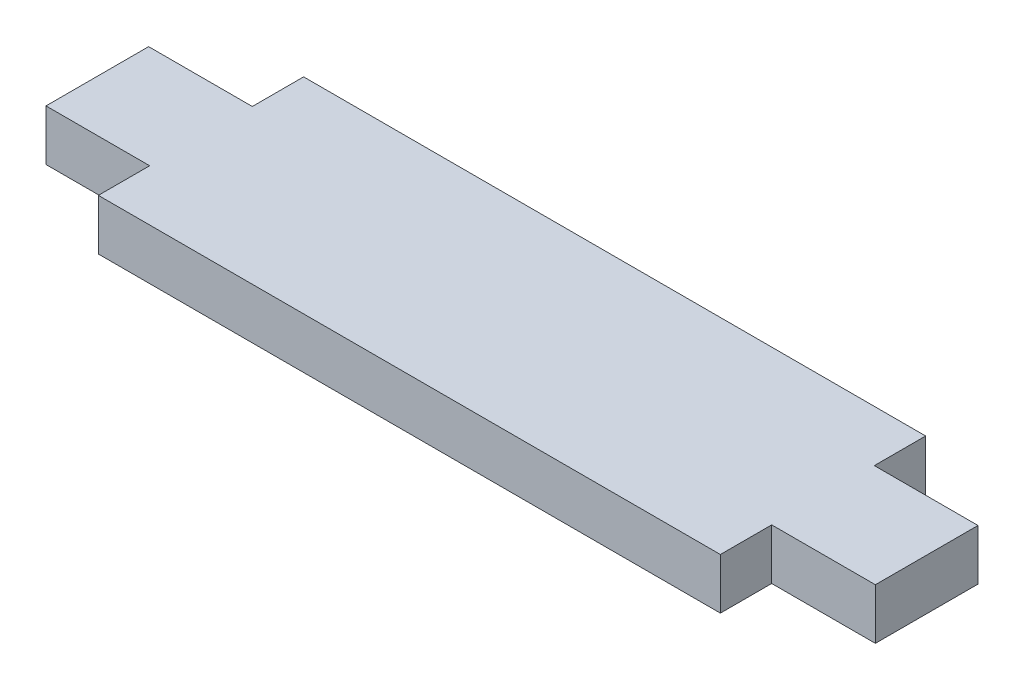
ISO-10303-21;
HEADER;
FILE_DESCRIPTION(('STEP AP214'),'2;1');
FILE_NAME('part.step','',(''),(''),'','','');
FILE_SCHEMA(('AUTOMOTIVE_DESIGN { 1 0 10303 214 1 1 1 1 }'));
ENDSEC;
DATA;
#1=APPLICATION_CONTEXT('core data for automotive mechanical design processes');
#2=APPLICATION_PROTOCOL_DEFINITION('international standard','automotive_design',2000,#1);
#3=PRODUCT_CONTEXT('',#1,'mechanical');
#4=PRODUCT('Part','Part','',(#3));
#5=PRODUCT_RELATED_PRODUCT_CATEGORY('part','',(#4));
#6=PRODUCT_DEFINITION_FORMATION('','',#4);
#7=PRODUCT_DEFINITION_CONTEXT('part definition',#1,'design');
#8=PRODUCT_DEFINITION('design','',#6,#7);
#9=PRODUCT_DEFINITION_SHAPE('','',#8);
#10=(LENGTH_UNIT() NAMED_UNIT(*) SI_UNIT(.MILLI.,.METRE.));
#11=(NAMED_UNIT(*) PLANE_ANGLE_UNIT() SI_UNIT($,.RADIAN.));
#12=(NAMED_UNIT(*) SI_UNIT($,.STERADIAN.) SOLID_ANGLE_UNIT());
#13=UNCERTAINTY_MEASURE_WITH_UNIT(LENGTH_MEASURE(1.E-05),#10,'distance_accuracy_value','');
#14=(GEOMETRIC_REPRESENTATION_CONTEXT(3) GLOBAL_UNCERTAINTY_ASSIGNED_CONTEXT((#13)) GLOBAL_UNIT_ASSIGNED_CONTEXT((#10,
#11,#12)) REPRESENTATION_CONTEXT('',''));
#15=CARTESIAN_POINT('',(0.,0.,0.));
#16=DIRECTION('',(0.,0.,1.));
#17=DIRECTION('',(1.,0.,0.));
#18=AXIS2_PLACEMENT_3D('',#15,#16,#17);
#19=CARTESIAN_POINT('',(-30.,0.,0.));
#20=DIRECTION('',(-1.,0.,0.));
#21=DIRECTION('',(0.,0.,1.));
#22=AXIS2_PLACEMENT_3D('',#19,#20,#21);
#23=PLANE('',#22);
#24=DIRECTION('',(0.,0.,-1.));
#25=VECTOR('',#24,1.);
#26=CARTESIAN_POINT('',(-30.,-2.45,9.9));
#27=LINE('',#26,#25);
#28=CARTESIAN_POINT('',(-30.,-2.45,-4.95));
#29=VERTEX_POINT('',#28);
#30=CARTESIAN_POINT('',(-30.,-2.45,-9.9));
#31=VERTEX_POINT('',#30);
#32=EDGE_CURVE('E238',#29,#31,#27,.T.);
#33=ORIENTED_EDGE('',*,*,#32,.F.);
#34=DIRECTION('',(0.,1.,0.));
#35=VECTOR('',#34,1.);
#36=CARTESIAN_POINT('',(-30.,-2.45,-4.95));
#37=LINE('',#36,#35);
#38=CARTESIAN_POINT('',(-30.,2.45,-4.95));
#39=VERTEX_POINT('',#38);
#40=EDGE_CURVE('E136',#29,#39,#37,.T.);
#41=ORIENTED_EDGE('',*,*,#40,.T.);
#42=DIRECTION('',(0.,0.,1.));
#43=VECTOR('',#42,1.);
#44=CARTESIAN_POINT('',(-30.,2.45,9.9));
#45=LINE('',#44,#43);
#46=CARTESIAN_POINT('',(-30.,2.45,-9.9));
#47=VERTEX_POINT('',#46);
#48=EDGE_CURVE('E231',#47,#39,#45,.T.);
#49=ORIENTED_EDGE('',*,*,#48,.F.);
#50=DIRECTION('',(0.,1.,0.));
#51=VECTOR('',#50,1.);
#52=CARTESIAN_POINT('',(-30.,-2.45,-9.9));
#53=LINE('',#52,#51);
#54=EDGE_CURVE('E209',#31,#47,#53,.T.);
#55=ORIENTED_EDGE('',*,*,#54,.F.);
#56=EDGE_LOOP('',(#33,#41,#49,#55));
#57=FACE_BOUND('',#56,.T.);
#58=ADVANCED_FACE('F39',(#57),#23,.T.);
#59=CARTESIAN_POINT('',(-30.,2.45,4.95));
#60=VERTEX_POINT('',#59);
#61=CARTESIAN_POINT('',(-30.,2.45,9.9));
#62=VERTEX_POINT('',#61);
#63=EDGE_CURVE('E230',#60,#62,#45,.T.);
#64=ORIENTED_EDGE('',*,*,#63,.F.);
#65=DIRECTION('',(0.,-1.,0.));
#66=VECTOR('',#65,1.);
#67=CARTESIAN_POINT('',(-30.,-2.45,4.95));
#68=LINE('',#67,#66);
#69=CARTESIAN_POINT('',(-30.,-2.45,4.95));
#70=VERTEX_POINT('',#69);
#71=EDGE_CURVE('E150',#60,#70,#68,.T.);
#72=ORIENTED_EDGE('',*,*,#71,.T.);
#73=CARTESIAN_POINT('',(-30.,-2.45,9.9));
#74=VERTEX_POINT('',#73);
#75=EDGE_CURVE('E215',#74,#70,#27,.T.);
#76=ORIENTED_EDGE('',*,*,#75,.F.);
#77=DIRECTION('',(0.,-1.,0.));
#78=VECTOR('',#77,1.);
#79=CARTESIAN_POINT('',(-30.,-2.45,9.9));
#80=LINE('',#79,#78);
#81=EDGE_CURVE('E235',#62,#74,#80,.T.);
#82=ORIENTED_EDGE('',*,*,#81,.F.);
#83=EDGE_LOOP('',(#64,#72,#76,#82));
#84=FACE_BOUND('',#83,.T.);
#85=ADVANCED_FACE('F260',(#84),#23,.T.);
#86=CARTESIAN_POINT('',(30.,0.,0.));
#87=DIRECTION('',(-1.,0.,0.));
#88=DIRECTION('',(0.,0.,1.));
#89=AXIS2_PLACEMENT_3D('',#86,#87,#88);
#90=PLANE('',#89);
#91=DIRECTION('',(0.,1.,0.));
#92=VECTOR('',#91,1.);
#93=CARTESIAN_POINT('',(30.,-2.45,-4.95));
#94=LINE('',#93,#92);
#95=CARTESIAN_POINT('',(30.,-2.45,-4.95));
#96=VERTEX_POINT('',#95);
#97=CARTESIAN_POINT('',(30.,2.45,-4.95));
#98=VERTEX_POINT('',#97);
#99=EDGE_CURVE('E63',#96,#98,#94,.T.);
#100=ORIENTED_EDGE('',*,*,#99,.F.);
#101=DIRECTION('',(0.,0.,-1.));
#102=VECTOR('',#101,1.);
#103=CARTESIAN_POINT('',(30.,-2.45,9.9));
#104=LINE('',#103,#102);
#105=CARTESIAN_POINT('',(30.,-2.45,-9.9));
#106=VERTEX_POINT('',#105);
#107=EDGE_CURVE('E222',#96,#106,#104,.T.);
#108=ORIENTED_EDGE('',*,*,#107,.T.);
#109=DIRECTION('',(0.,1.,0.));
#110=VECTOR('',#109,1.);
#111=CARTESIAN_POINT('',(30.,-2.45,-9.9));
#112=LINE('',#111,#110);
#113=CARTESIAN_POINT('',(30.,2.45,-9.9));
#114=VERTEX_POINT('',#113);
#115=EDGE_CURVE('E210',#106,#114,#112,.T.);
#116=ORIENTED_EDGE('',*,*,#115,.T.);
#117=DIRECTION('',(0.,0.,1.));
#118=VECTOR('',#117,1.);
#119=CARTESIAN_POINT('',(30.,2.45,9.9));
#120=LINE('',#119,#118);
#121=EDGE_CURVE('E216',#114,#98,#120,.T.);
#122=ORIENTED_EDGE('',*,*,#121,.T.);
#123=EDGE_LOOP('',(#100,#108,#116,#122));
#124=FACE_BOUND('',#123,.T.);
#125=ADVANCED_FACE('F290',(#124),#90,.F.);
#126=DIRECTION('',(0.,-1.,0.));
#127=VECTOR('',#126,1.);
#128=CARTESIAN_POINT('',(30.,-2.45,4.95));
#129=LINE('',#128,#127);
#130=CARTESIAN_POINT('',(30.,2.45,4.95));
#131=VERTEX_POINT('',#130);
#132=CARTESIAN_POINT('',(30.,-2.45,4.95));
#133=VERTEX_POINT('',#132);
#134=EDGE_CURVE('E179',#131,#133,#129,.T.);
#135=ORIENTED_EDGE('',*,*,#134,.F.);
#136=CARTESIAN_POINT('',(30.,2.45,9.9));
#137=VERTEX_POINT('',#136);
#138=EDGE_CURVE('E214',#131,#137,#120,.T.);
#139=ORIENTED_EDGE('',*,*,#138,.T.);
#140=DIRECTION('',(0.,-1.,0.));
#141=VECTOR('',#140,1.);
#142=CARTESIAN_POINT('',(30.,-2.45,9.9));
#143=LINE('',#142,#141);
#144=CARTESIAN_POINT('',(30.,-2.45,9.9));
#145=VERTEX_POINT('',#144);
#146=EDGE_CURVE('E219',#137,#145,#143,.T.);
#147=ORIENTED_EDGE('',*,*,#146,.T.);
#148=EDGE_CURVE('E223',#145,#133,#104,.T.);
#149=ORIENTED_EDGE('',*,*,#148,.T.);
#150=EDGE_LOOP('',(#135,#139,#147,#149));
#151=FACE_BOUND('',#150,.T.);
#152=ADVANCED_FACE('F265',(#151),#90,.F.);
#153=CARTESIAN_POINT('',(30.,-2.45,-9.9));
#154=DIRECTION('',(0.,0.,1.));
#155=DIRECTION('',(1.,0.,0.));
#156=AXIS2_PLACEMENT_3D('',#153,#154,#155);
#157=PLANE('',#156);
#158=ORIENTED_EDGE('',*,*,#54,.T.);
#159=DIRECTION('',(-1.,0.,0.));
#160=VECTOR('',#159,1.);
#161=CARTESIAN_POINT('',(30.,2.45,-9.9));
#162=LINE('',#161,#160);
#163=EDGE_CURVE('E11',#114,#47,#162,.T.);
#164=ORIENTED_EDGE('',*,*,#163,.F.);
#165=ORIENTED_EDGE('',*,*,#115,.F.);
#166=DIRECTION('',(-1.,0.,0.));
#167=VECTOR('',#166,1.);
#168=CARTESIAN_POINT('',(30.,-2.45,-9.9));
#169=LINE('',#168,#167);
#170=EDGE_CURVE('E226',#106,#31,#169,.T.);
#171=ORIENTED_EDGE('',*,*,#170,.T.);
#172=EDGE_LOOP('',(#158,#164,#165,#171));
#173=FACE_BOUND('',#172,.T.);
#174=ADVANCED_FACE('F41',(#173),#157,.F.);
#175=CARTESIAN_POINT('',(30.,2.45,9.9));
#176=DIRECTION('',(0.,-1.,0.));
#177=DIRECTION('',(0.,0.,-1.));
#178=AXIS2_PLACEMENT_3D('',#175,#176,#177);
#179=PLANE('',#178);
#180=ORIENTED_EDGE('',*,*,#48,.T.);
#181=DIRECTION('',(1.,0.,0.));
#182=VECTOR('',#181,1.);
#183=CARTESIAN_POINT('',(-40.,2.45,-4.95));
#184=LINE('',#183,#182);
#185=CARTESIAN_POINT('',(-40.,2.45,-4.95));
#186=VERTEX_POINT('',#185);
#187=EDGE_CURVE('E162',#186,#39,#184,.T.);
#188=ORIENTED_EDGE('',*,*,#187,.F.);
#189=DIRECTION('',(0.,0.,1.));
#190=VECTOR('',#189,1.);
#191=CARTESIAN_POINT('',(-40.,2.45,4.95));
#192=LINE('',#191,#190);
#193=CARTESIAN_POINT('',(-40.,2.45,4.95));
#194=VERTEX_POINT('',#193);
#195=EDGE_CURVE('E148',#186,#194,#192,.T.);
#196=ORIENTED_EDGE('',*,*,#195,.T.);
#197=DIRECTION('',(1.,0.,0.));
#198=VECTOR('',#197,1.);
#199=CARTESIAN_POINT('',(-40.,2.45,4.95));
#200=LINE('',#199,#198);
#201=EDGE_CURVE('E169',#194,#60,#200,.T.);
#202=ORIENTED_EDGE('',*,*,#201,.T.);
#203=ORIENTED_EDGE('',*,*,#63,.T.);
#204=DIRECTION('',(-1.,0.,0.));
#205=VECTOR('',#204,1.);
#206=CARTESIAN_POINT('',(30.,2.45,9.9));
#207=LINE('',#206,#205);
#208=EDGE_CURVE('E48',#137,#62,#207,.T.);
#209=ORIENTED_EDGE('',*,*,#208,.F.);
#210=ORIENTED_EDGE('',*,*,#138,.F.);
#211=DIRECTION('',(-1.,0.,0.));
#212=VECTOR('',#211,1.);
#213=CARTESIAN_POINT('',(40.,2.45,4.95));
#214=LINE('',#213,#212);
#215=CARTESIAN_POINT('',(40.,2.45,4.95));
#216=VERTEX_POINT('',#215);
#217=EDGE_CURVE('E201',#216,#131,#214,.T.);
#218=ORIENTED_EDGE('',*,*,#217,.F.);
#219=DIRECTION('',(0.,0.,1.));
#220=VECTOR('',#219,1.);
#221=CARTESIAN_POINT('',(40.,2.45,4.95));
#222=LINE('',#221,#220);
#223=CARTESIAN_POINT('',(40.,2.45,-4.95));
#224=VERTEX_POINT('',#223);
#225=EDGE_CURVE('E178',#224,#216,#222,.T.);
#226=ORIENTED_EDGE('',*,*,#225,.F.);
#227=DIRECTION('',(-1.,0.,0.));
#228=VECTOR('',#227,1.);
#229=CARTESIAN_POINT('',(40.,2.45,-4.95));
#230=LINE('',#229,#228);
#231=EDGE_CURVE('E205',#224,#98,#230,.T.);
#232=ORIENTED_EDGE('',*,*,#231,.T.);
#233=ORIENTED_EDGE('',*,*,#121,.F.);
#234=ORIENTED_EDGE('',*,*,#163,.T.);
#235=EDGE_LOOP('',(#180,#188,#196,#202,#203,#209,#210,#218,#226,#232,#233,#234));
#236=FACE_BOUND('',#235,.T.);
#237=ADVANCED_FACE('F270',(#236),#179,.F.);
#238=CARTESIAN_POINT('',(30.,-2.45,9.9));
#239=DIRECTION('',(0.,0.,-1.));
#240=DIRECTION('',(-1.,0.,0.));
#241=AXIS2_PLACEMENT_3D('',#238,#239,#240);
#242=PLANE('',#241);
#243=ORIENTED_EDGE('',*,*,#81,.T.);
#244=DIRECTION('',(-1.,0.,0.));
#245=VECTOR('',#244,1.);
#246=CARTESIAN_POINT('',(30.,-2.45,9.9));
#247=LINE('',#246,#245);
#248=EDGE_CURVE('E244',#145,#74,#247,.T.);
#249=ORIENTED_EDGE('',*,*,#248,.F.);
#250=ORIENTED_EDGE('',*,*,#146,.F.);
#251=ORIENTED_EDGE('',*,*,#208,.T.);
#252=EDGE_LOOP('',(#243,#249,#250,#251));
#253=FACE_BOUND('',#252,.T.);
#254=ADVANCED_FACE('F253',(#253),#242,.F.);
#255=CARTESIAN_POINT('',(30.,-2.45,9.9));
#256=DIRECTION('',(0.,1.,0.));
#257=DIRECTION('',(0.,0.,1.));
#258=AXIS2_PLACEMENT_3D('',#255,#256,#257);
#259=PLANE('',#258);
#260=ORIENTED_EDGE('',*,*,#75,.T.);
#261=DIRECTION('',(1.,0.,0.));
#262=VECTOR('',#261,1.);
#263=CARTESIAN_POINT('',(-40.,-2.45,4.95));
#264=LINE('',#263,#262);
#265=CARTESIAN_POINT('',(-40.,-2.45,4.95));
#266=VERTEX_POINT('',#265);
#267=EDGE_CURVE('E55',#266,#70,#264,.T.);
#268=ORIENTED_EDGE('',*,*,#267,.F.);
#269=DIRECTION('',(0.,0.,-1.));
#270=VECTOR('',#269,1.);
#271=CARTESIAN_POINT('',(-40.,-2.45,4.95));
#272=LINE('',#271,#270);
#273=CARTESIAN_POINT('',(-40.,-2.45,-4.95));
#274=VERTEX_POINT('',#273);
#275=EDGE_CURVE('E146',#266,#274,#272,.T.);
#276=ORIENTED_EDGE('',*,*,#275,.T.);
#277=DIRECTION('',(1.,0.,0.));
#278=VECTOR('',#277,1.);
#279=CARTESIAN_POINT('',(-40.,-2.45,-4.95));
#280=LINE('',#279,#278);
#281=EDGE_CURVE('E130',#274,#29,#280,.T.);
#282=ORIENTED_EDGE('',*,*,#281,.T.);
#283=ORIENTED_EDGE('',*,*,#32,.T.);
#284=ORIENTED_EDGE('',*,*,#170,.F.);
#285=ORIENTED_EDGE('',*,*,#107,.F.);
#286=DIRECTION('',(-1.,0.,0.));
#287=VECTOR('',#286,1.);
#288=CARTESIAN_POINT('',(40.,-2.45,-4.95));
#289=LINE('',#288,#287);
#290=CARTESIAN_POINT('',(40.,-2.45,-4.95));
#291=VERTEX_POINT('',#290);
#292=EDGE_CURVE('E188',#291,#96,#289,.T.);
#293=ORIENTED_EDGE('',*,*,#292,.F.);
#294=DIRECTION('',(0.,0.,-1.));
#295=VECTOR('',#294,1.);
#296=CARTESIAN_POINT('',(40.,-2.45,4.95));
#297=LINE('',#296,#295);
#298=CARTESIAN_POINT('',(40.,-2.45,4.95));
#299=VERTEX_POINT('',#298);
#300=EDGE_CURVE('E185',#299,#291,#297,.T.);
#301=ORIENTED_EDGE('',*,*,#300,.F.);
#302=DIRECTION('',(-1.,0.,0.));
#303=VECTOR('',#302,1.);
#304=CARTESIAN_POINT('',(40.,-2.45,4.95));
#305=LINE('',#304,#303);
#306=EDGE_CURVE('E197',#299,#133,#305,.T.);
#307=ORIENTED_EDGE('',*,*,#306,.T.);
#308=ORIENTED_EDGE('',*,*,#148,.F.);
#309=ORIENTED_EDGE('',*,*,#248,.T.);
#310=EDGE_LOOP('',(#260,#268,#276,#282,#283,#284,#285,#293,#301,#307,#308,#309));
#311=FACE_BOUND('',#310,.T.);
#312=ADVANCED_FACE('F153',(#311),#259,.F.);
#313=CARTESIAN_POINT('',(40.,-2.45,-4.95));
#314=DIRECTION('',(0.,0.,1.));
#315=DIRECTION('',(1.,0.,0.));
#316=AXIS2_PLACEMENT_3D('',#313,#314,#315);
#317=PLANE('',#316);
#318=ORIENTED_EDGE('',*,*,#99,.T.);
#319=ORIENTED_EDGE('',*,*,#231,.F.);
#320=DIRECTION('',(0.,1.,0.));
#321=VECTOR('',#320,1.);
#322=CARTESIAN_POINT('',(40.,-2.45,-4.95));
#323=LINE('',#322,#321);
#324=EDGE_CURVE('E174',#291,#224,#323,.T.);
#325=ORIENTED_EDGE('',*,*,#324,.F.);
#326=ORIENTED_EDGE('',*,*,#292,.T.);
#327=EDGE_LOOP('',(#318,#319,#325,#326));
#328=FACE_BOUND('',#327,.T.);
#329=ADVANCED_FACE('F296',(#328),#317,.F.);
#330=CARTESIAN_POINT('',(40.,-2.45,4.95));
#331=DIRECTION('',(0.,0.,-1.));
#332=DIRECTION('',(-1.,0.,0.));
#333=AXIS2_PLACEMENT_3D('',#330,#331,#332);
#334=PLANE('',#333);
#335=ORIENTED_EDGE('',*,*,#134,.T.);
#336=ORIENTED_EDGE('',*,*,#306,.F.);
#337=DIRECTION('',(0.,-1.,0.));
#338=VECTOR('',#337,1.);
#339=CARTESIAN_POINT('',(40.,-2.45,4.95));
#340=LINE('',#339,#338);
#341=EDGE_CURVE('E182',#216,#299,#340,.T.);
#342=ORIENTED_EDGE('',*,*,#341,.F.);
#343=ORIENTED_EDGE('',*,*,#217,.T.);
#344=EDGE_LOOP('',(#335,#336,#342,#343));
#345=FACE_BOUND('',#344,.T.);
#346=ADVANCED_FACE('F267',(#345),#334,.F.);
#347=CARTESIAN_POINT('',(40.,0.,0.));
#348=DIRECTION('',(-1.,0.,0.));
#349=DIRECTION('',(0.,0.,1.));
#350=AXIS2_PLACEMENT_3D('',#347,#348,#349);
#351=PLANE('',#350);
#352=ORIENTED_EDGE('',*,*,#324,.T.);
#353=ORIENTED_EDGE('',*,*,#225,.T.);
#354=ORIENTED_EDGE('',*,*,#341,.T.);
#355=ORIENTED_EDGE('',*,*,#300,.T.);
#356=EDGE_LOOP('',(#352,#353,#354,#355));
#357=FACE_BOUND('',#356,.T.);
#358=ADVANCED_FACE('F282',(#357),#351,.F.);
#359=CARTESIAN_POINT('',(-40.,-2.45,-4.95));
#360=DIRECTION('',(0.,0.,-1.));
#361=DIRECTION('',(-1.,0.,0.));
#362=AXIS2_PLACEMENT_3D('',#359,#360,#361);
#363=PLANE('',#362);
#364=ORIENTED_EDGE('',*,*,#40,.F.);
#365=ORIENTED_EDGE('',*,*,#281,.F.);
#366=DIRECTION('',(0.,1.,0.));
#367=VECTOR('',#366,1.);
#368=CARTESIAN_POINT('',(-40.,-2.45,-4.95));
#369=LINE('',#368,#367);
#370=EDGE_CURVE('E133',#274,#186,#369,.T.);
#371=ORIENTED_EDGE('',*,*,#370,.T.);
#372=ORIENTED_EDGE('',*,*,#187,.T.);
#373=EDGE_LOOP('',(#364,#365,#371,#372));
#374=FACE_BOUND('',#373,.T.);
#375=ADVANCED_FACE('F132',(#374),#363,.T.);
#376=CARTESIAN_POINT('',(-40.,-2.45,4.95));
#377=DIRECTION('',(0.,0.,1.));
#378=DIRECTION('',(1.,0.,0.));
#379=AXIS2_PLACEMENT_3D('',#376,#377,#378);
#380=PLANE('',#379);
#381=ORIENTED_EDGE('',*,*,#71,.F.);
#382=ORIENTED_EDGE('',*,*,#201,.F.);
#383=DIRECTION('',(0.,-1.,0.));
#384=VECTOR('',#383,1.);
#385=CARTESIAN_POINT('',(-40.,-2.45,4.95));
#386=LINE('',#385,#384);
#387=EDGE_CURVE('E155',#194,#266,#386,.T.);
#388=ORIENTED_EDGE('',*,*,#387,.T.);
#389=ORIENTED_EDGE('',*,*,#267,.T.);
#390=EDGE_LOOP('',(#381,#382,#388,#389));
#391=FACE_BOUND('',#390,.T.);
#392=ADVANCED_FACE('F274',(#391),#380,.T.);
#393=CARTESIAN_POINT('',(-40.,0.,0.));
#394=DIRECTION('',(1.,0.,0.));
#395=DIRECTION('',(0.,0.,1.));
#396=AXIS2_PLACEMENT_3D('',#393,#394,#395);
#397=PLANE('',#396);
#398=ORIENTED_EDGE('',*,*,#370,.F.);
#399=ORIENTED_EDGE('',*,*,#275,.F.);
#400=ORIENTED_EDGE('',*,*,#387,.F.);
#401=ORIENTED_EDGE('',*,*,#195,.F.);
#402=EDGE_LOOP('',(#398,#399,#400,#401));
#403=FACE_BOUND('',#402,.T.);
#404=ADVANCED_FACE('F144',(#403),#397,.F.);
#405=CLOSED_SHELL('',(#58,#85,#125,#152,#174,#237,#254,#312,#329,#346,#358,#375,#392,#404));
#406=MANIFOLD_SOLID_BREP('B2',#405);
#407=ADVANCED_BREP_SHAPE_REPRESENTATION('',(#18,#406),#14);
#408=SHAPE_DEFINITION_REPRESENTATION(#9,#407);
ENDSEC;
END-ISO-10303-21;
